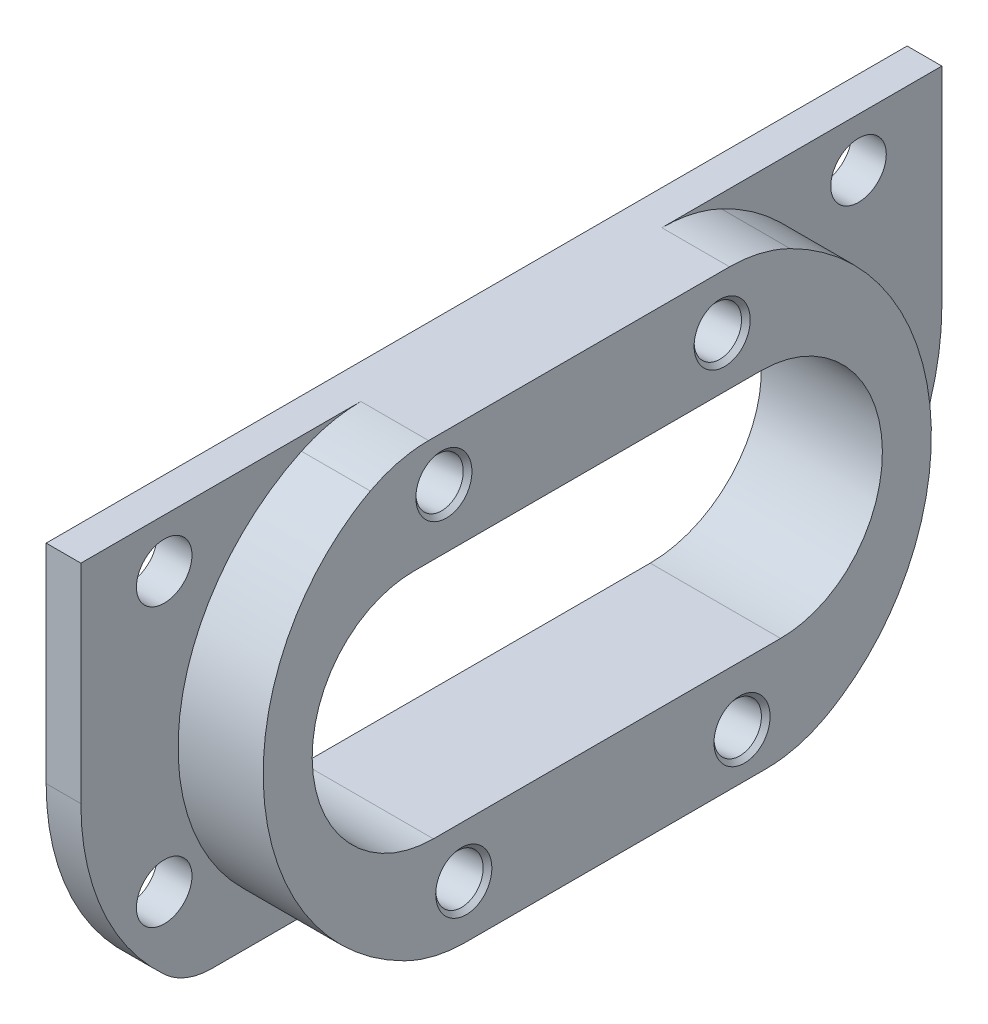
ISO-10303-21;
HEADER;
FILE_DESCRIPTION(('STEP AP214'),'2;1');
FILE_NAME('part.step','',(''),(''),'','','');
FILE_SCHEMA(('AUTOMOTIVE_DESIGN { 1 0 10303 214 1 1 1 1 }'));
ENDSEC;
DATA;
#1=APPLICATION_CONTEXT('core data for automotive mechanical design processes');
#2=APPLICATION_PROTOCOL_DEFINITION('international standard','automotive_design',2000,#1);
#3=PRODUCT_CONTEXT('',#1,'mechanical');
#4=PRODUCT('Part','Part','',(#3));
#5=PRODUCT_RELATED_PRODUCT_CATEGORY('part','',(#4));
#6=PRODUCT_DEFINITION_FORMATION('','',#4);
#7=PRODUCT_DEFINITION_CONTEXT('part definition',#1,'design');
#8=PRODUCT_DEFINITION('design','',#6,#7);
#9=PRODUCT_DEFINITION_SHAPE('','',#8);
#10=(LENGTH_UNIT() NAMED_UNIT(*) SI_UNIT(.MILLI.,.METRE.));
#11=(NAMED_UNIT(*) PLANE_ANGLE_UNIT() SI_UNIT($,.RADIAN.));
#12=(NAMED_UNIT(*) SI_UNIT($,.STERADIAN.) SOLID_ANGLE_UNIT());
#13=UNCERTAINTY_MEASURE_WITH_UNIT(LENGTH_MEASURE(1.E-05),#10,'distance_accuracy_value','');
#14=(GEOMETRIC_REPRESENTATION_CONTEXT(3) GLOBAL_UNCERTAINTY_ASSIGNED_CONTEXT((#13)) GLOBAL_UNIT_ASSIGNED_CONTEXT((#10,
#11,#12)) REPRESENTATION_CONTEXT('',''));
#15=CARTESIAN_POINT('',(0.,0.,0.));
#16=DIRECTION('',(0.,0.,1.));
#17=DIRECTION('',(1.,0.,0.));
#18=AXIS2_PLACEMENT_3D('',#15,#16,#17);
#19=CARTESIAN_POINT('',(20.,0.,-25.));
#20=DIRECTION('',(-1.,0.,0.));
#21=DIRECTION('',(0.,0.,1.));
#22=AXIS2_PLACEMENT_3D('',#19,#20,#21);
#23=CYLINDRICAL_SURFACE('',#22,37.);
#24=CARTESIAN_POINT('',(5.,0.,-25.));
#25=DIRECTION('',(1.,0.,0.));
#26=DIRECTION('',(0.,0.,-1.));
#27=AXIS2_PLACEMENT_3D('',#24,#25,#26);
#28=CIRCLE('',#27,37.);
#29=CARTESIAN_POINT('',(5.,-27.4074074074074,-49.8562672017419));
#30=VERTEX_POINT('',#29);
#31=CARTESIAN_POINT('',(5.,0.,-62.));
#32=VERTEX_POINT('',#31);
#33=EDGE_CURVE('E304',#30,#32,#28,.T.);
#34=ORIENTED_EDGE('',*,*,#33,.F.);
#35=DIRECTION('',(-1.,0.,0.));
#36=VECTOR('',#35,1.);
#37=CARTESIAN_POINT('',(20.,-27.4074074074074,-49.8562672017419));
#38=LINE('',#37,#36);
#39=CARTESIAN_POINT('',(0.,-27.4074074074074,-49.8562672017419));
#40=VERTEX_POINT('',#39);
#41=EDGE_CURVE('E353',#30,#40,#38,.T.);
#42=ORIENTED_EDGE('',*,*,#41,.T.);
#43=CARTESIAN_POINT('',(0.,0.,-25.));
#44=DIRECTION('',(1.,0.,0.));
#45=DIRECTION('',(0.,0.,-1.));
#46=AXIS2_PLACEMENT_3D('',#43,#44,#45);
#47=CIRCLE('',#46,37.);
#48=CARTESIAN_POINT('',(0.,0.,-62.));
#49=VERTEX_POINT('',#48);
#50=EDGE_CURVE('E350',#40,#49,#47,.T.);
#51=ORIENTED_EDGE('',*,*,#50,.T.);
#52=DIRECTION('',(-1.,0.,0.));
#53=VECTOR('',#52,1.);
#54=CARTESIAN_POINT('',(20.,0.,-62.));
#55=LINE('',#54,#53);
#56=EDGE_CURVE('E48',#32,#49,#55,.T.);
#57=ORIENTED_EDGE('',*,*,#56,.F.);
#58=EDGE_LOOP('',(#34,#42,#51,#57));
#59=FACE_BOUND('',#58,.T.);
#60=ADVANCED_FACE('F41',(#59),#23,.T.);
#61=CARTESIAN_POINT('',(20.,0.,-62.));
#62=DIRECTION('',(0.,0.,1.));
#63=DIRECTION('',(0.,-1.,0.));
#64=AXIS2_PLACEMENT_3D('',#61,#62,#63);
#65=PLANE('',#64);
#66=DIRECTION('',(0.,1.,0.));
#67=VECTOR('',#66,1.);
#68=CARTESIAN_POINT('',(5.,0.,-62.));
#69=LINE('',#68,#67);
#70=CARTESIAN_POINT('',(5.,30.,-62.));
#71=VERTEX_POINT('',#70);
#72=EDGE_CURVE('E307',#32,#71,#69,.T.);
#73=ORIENTED_EDGE('',*,*,#72,.F.);
#74=ORIENTED_EDGE('',*,*,#56,.T.);
#75=DIRECTION('',(0.,1.,0.));
#76=VECTOR('',#75,1.);
#77=CARTESIAN_POINT('',(0.,0.,-62.));
#78=LINE('',#77,#76);
#79=CARTESIAN_POINT('',(0.,30.,-62.));
#80=VERTEX_POINT('',#79);
#81=EDGE_CURVE('E357',#49,#80,#78,.T.);
#82=ORIENTED_EDGE('',*,*,#81,.T.);
#83=DIRECTION('',(-1.,0.,0.));
#84=VECTOR('',#83,1.);
#85=CARTESIAN_POINT('',(20.,30.,-62.));
#86=LINE('',#85,#84);
#87=EDGE_CURVE('E388',#71,#80,#86,.T.);
#88=ORIENTED_EDGE('',*,*,#87,.F.);
#89=EDGE_LOOP('',(#73,#74,#82,#88));
#90=FACE_BOUND('',#89,.T.);
#91=ADVANCED_FACE('F472',(#90),#65,.F.);
#92=CARTESIAN_POINT('',(20.,30.,62.));
#93=DIRECTION('',(0.,0.,-1.));
#94=DIRECTION('',(0.,1.,0.));
#95=AXIS2_PLACEMENT_3D('',#92,#93,#94);
#96=PLANE('',#95);
#97=DIRECTION('',(0.,-1.,0.));
#98=VECTOR('',#97,1.);
#99=CARTESIAN_POINT('',(5.,30.,62.));
#100=LINE('',#99,#98);
#101=CARTESIAN_POINT('',(5.,30.,62.));
#102=VERTEX_POINT('',#101);
#103=CARTESIAN_POINT('',(5.,0.,62.));
#104=VERTEX_POINT('',#103);
#105=EDGE_CURVE('E316',#102,#104,#100,.T.);
#106=ORIENTED_EDGE('',*,*,#105,.F.);
#107=DIRECTION('',(-1.,0.,0.));
#108=VECTOR('',#107,1.);
#109=CARTESIAN_POINT('',(20.,30.,62.));
#110=LINE('',#109,#108);
#111=CARTESIAN_POINT('',(0.,30.,62.));
#112=VERTEX_POINT('',#111);
#113=EDGE_CURVE('E386',#102,#112,#110,.T.);
#114=ORIENTED_EDGE('',*,*,#113,.T.);
#115=DIRECTION('',(0.,-1.,0.));
#116=VECTOR('',#115,1.);
#117=CARTESIAN_POINT('',(0.,30.,62.));
#118=LINE('',#117,#116);
#119=CARTESIAN_POINT('',(0.,0.,62.));
#120=VERTEX_POINT('',#119);
#121=EDGE_CURVE('E363',#112,#120,#118,.T.);
#122=ORIENTED_EDGE('',*,*,#121,.T.);
#123=DIRECTION('',(-1.,0.,0.));
#124=VECTOR('',#123,1.);
#125=CARTESIAN_POINT('',(20.,0.,62.));
#126=LINE('',#125,#124);
#127=EDGE_CURVE('E384',#104,#120,#126,.T.);
#128=ORIENTED_EDGE('',*,*,#127,.F.);
#129=EDGE_LOOP('',(#106,#114,#122,#128));
#130=FACE_BOUND('',#129,.T.);
#131=ADVANCED_FACE('F413',(#130),#96,.F.);
#132=CARTESIAN_POINT('',(20.,0.,25.));
#133=DIRECTION('',(-1.,0.,0.));
#134=DIRECTION('',(0.,0.,1.));
#135=AXIS2_PLACEMENT_3D('',#132,#133,#134);
#136=CYLINDRICAL_SURFACE('',#135,37.);
#137=CARTESIAN_POINT('',(5.,0.,25.));
#138=DIRECTION('',(1.,0.,0.));
#139=DIRECTION('',(0.,0.,-1.));
#140=AXIS2_PLACEMENT_3D('',#137,#138,#139);
#141=CIRCLE('',#140,37.);
#142=CARTESIAN_POINT('',(5.,-27.4074074074074,49.8562672017419));
#143=VERTEX_POINT('',#142);
#144=EDGE_CURVE('E314',#104,#143,#141,.T.);
#145=ORIENTED_EDGE('',*,*,#144,.F.);
#146=ORIENTED_EDGE('',*,*,#127,.T.);
#147=CARTESIAN_POINT('',(0.,0.,25.));
#148=DIRECTION('',(1.,0.,0.));
#149=DIRECTION('',(0.,0.,-1.));
#150=AXIS2_PLACEMENT_3D('',#147,#148,#149);
#151=CIRCLE('',#150,37.);
#152=CARTESIAN_POINT('',(0.,-27.4074074074074,49.8562672017419));
#153=VERTEX_POINT('',#152);
#154=EDGE_CURVE('E366',#120,#153,#151,.T.);
#155=ORIENTED_EDGE('',*,*,#154,.T.);
#156=DIRECTION('',(-1.,0.,0.));
#157=VECTOR('',#156,1.);
#158=CARTESIAN_POINT('',(20.,-27.4074074074074,49.8562672017419));
#159=LINE('',#158,#157);
#160=EDGE_CURVE('E382',#143,#153,#159,.T.);
#161=ORIENTED_EDGE('',*,*,#160,.F.);
#162=EDGE_LOOP('',(#145,#146,#155,#161));
#163=FACE_BOUND('',#162,.T.);
#164=ADVANCED_FACE('F429',(#163),#136,.T.);
#165=CARTESIAN_POINT('',(20.,-20.,43.138357147217));
#166=DIRECTION('',(-1.,0.,0.));
#167=DIRECTION('',(0.,0.,1.));
#168=AXIS2_PLACEMENT_3D('',#165,#166,#167);
#169=CYLINDRICAL_SURFACE('',#168,10.);
#170=CARTESIAN_POINT('',(5.,-20.,43.138357147217));
#171=DIRECTION('',(1.,0.,0.));
#172=DIRECTION('',(0.,0.,-1.));
#173=AXIS2_PLACEMENT_3D('',#170,#171,#172);
#174=CIRCLE('',#173,10.);
#175=CARTESIAN_POINT('',(5.,-30.,43.138357147217));
#176=VERTEX_POINT('',#175);
#177=EDGE_CURVE('E312',#143,#176,#174,.T.);
#178=ORIENTED_EDGE('',*,*,#177,.F.);
#179=ORIENTED_EDGE('',*,*,#160,.T.);
#180=CARTESIAN_POINT('',(0.,-20.,43.138357147217));
#181=DIRECTION('',(1.,0.,0.));
#182=DIRECTION('',(0.,0.,-1.));
#183=AXIS2_PLACEMENT_3D('',#180,#181,#182);
#184=CIRCLE('',#183,10.);
#185=CARTESIAN_POINT('',(0.,-30.,43.138357147217));
#186=VERTEX_POINT('',#185);
#187=EDGE_CURVE('E369',#153,#186,#184,.T.);
#188=ORIENTED_EDGE('',*,*,#187,.T.);
#189=DIRECTION('',(-1.,0.,0.));
#190=VECTOR('',#189,1.);
#191=CARTESIAN_POINT('',(20.,-30.,43.138357147217));
#192=LINE('',#191,#190);
#193=EDGE_CURVE('E380',#176,#186,#192,.T.);
#194=ORIENTED_EDGE('',*,*,#193,.F.);
#195=EDGE_LOOP('',(#178,#179,#188,#194));
#196=FACE_BOUND('',#195,.T.);
#197=ADVANCED_FACE('F434',(#196),#169,.T.);
#198=CARTESIAN_POINT('',(20.,-30.,43.138357147217));
#199=DIRECTION('',(0.,1.,0.));
#200=DIRECTION('',(0.,0.,1.));
#201=AXIS2_PLACEMENT_3D('',#198,#199,#200);
#202=PLANE('',#201);
#203=DIRECTION('',(1.,0.,0.));
#204=VECTOR('',#203,1.);
#205=CARTESIAN_POINT('',(5.,-30.,21.6717685614745));
#206=LINE('',#205,#204);
#207=CARTESIAN_POINT('',(5.,-30.,21.6717685614745));
#208=VERTEX_POINT('',#207);
#209=CARTESIAN_POINT('',(20.,-30.,21.6717685614745));
#210=VERTEX_POINT('',#209);
#211=EDGE_CURVE('E267',#208,#210,#206,.T.);
#212=ORIENTED_EDGE('',*,*,#211,.F.);
#213=DIRECTION('',(0.,0.,-1.));
#214=VECTOR('',#213,1.);
#215=CARTESIAN_POINT('',(5.,-30.,43.138357147217));
#216=LINE('',#215,#214);
#217=EDGE_CURVE('E305',#176,#208,#216,.T.);
#218=ORIENTED_EDGE('',*,*,#217,.F.);
#219=ORIENTED_EDGE('',*,*,#193,.T.);
#220=DIRECTION('',(0.,0.,-1.));
#221=VECTOR('',#220,1.);
#222=CARTESIAN_POINT('',(0.,-30.,43.138357147217));
#223=LINE('',#222,#221);
#224=CARTESIAN_POINT('',(0.,-30.,-43.1383571472171));
#225=VERTEX_POINT('',#224);
#226=EDGE_CURVE('E372',#186,#225,#223,.T.);
#227=ORIENTED_EDGE('',*,*,#226,.T.);
#228=DIRECTION('',(-1.,0.,0.));
#229=VECTOR('',#228,1.);
#230=CARTESIAN_POINT('',(20.,-30.,-43.1383571472171));
#231=LINE('',#230,#229);
#232=CARTESIAN_POINT('',(5.,-30.,-43.1383571472171));
#233=VERTEX_POINT('',#232);
#234=EDGE_CURVE('E378',#233,#225,#231,.T.);
#235=ORIENTED_EDGE('',*,*,#234,.F.);
#236=CARTESIAN_POINT('',(5.,-30.,-21.6717685614745));
#237=VERTEX_POINT('',#236);
#238=EDGE_CURVE('E302',#237,#233,#216,.T.);
#239=ORIENTED_EDGE('',*,*,#238,.F.);
#240=DIRECTION('',(1.,0.,0.));
#241=VECTOR('',#240,1.);
#242=CARTESIAN_POINT('',(5.,-30.,-21.6717685614745));
#243=LINE('',#242,#241);
#244=CARTESIAN_POINT('',(20.,-30.,-21.6717685614745));
#245=VERTEX_POINT('',#244);
#246=EDGE_CURVE('E287',#237,#245,#243,.T.);
#247=ORIENTED_EDGE('',*,*,#246,.T.);
#248=DIRECTION('',(0.,0.,-1.));
#249=VECTOR('',#248,1.);
#250=CARTESIAN_POINT('',(20.,-30.,43.138357147217));
#251=LINE('',#250,#249);
#252=EDGE_CURVE('E351',#210,#245,#251,.T.);
#253=ORIENTED_EDGE('',*,*,#252,.F.);
#254=EDGE_LOOP('',(#212,#218,#219,#227,#235,#239,#247,#253));
#255=FACE_BOUND('',#254,.T.);
#256=ADVANCED_FACE('F437',(#255),#202,.F.);
#257=CARTESIAN_POINT('',(20.,-20.,-43.1383571472171));
#258=DIRECTION('',(-1.,0.,0.));
#259=DIRECTION('',(0.,0.,1.));
#260=AXIS2_PLACEMENT_3D('',#257,#258,#259);
#261=CYLINDRICAL_SURFACE('',#260,9.99999999999999);
#262=CARTESIAN_POINT('',(5.,-20.,-43.1383571472171));
#263=DIRECTION('',(1.,0.,0.));
#264=DIRECTION('',(0.,0.,-1.));
#265=AXIS2_PLACEMENT_3D('',#262,#263,#264);
#266=CIRCLE('',#265,9.99999999999999);
#267=EDGE_CURVE('E300',#233,#30,#266,.T.);
#268=ORIENTED_EDGE('',*,*,#267,.F.);
#269=ORIENTED_EDGE('',*,*,#234,.T.);
#270=CARTESIAN_POINT('',(0.,-20.,-43.1383571472171));
#271=DIRECTION('',(1.,0.,0.));
#272=DIRECTION('',(0.,0.,-1.));
#273=AXIS2_PLACEMENT_3D('',#270,#271,#272);
#274=CIRCLE('',#273,9.99999999999999);
#275=EDGE_CURVE('E354',#225,#40,#274,.T.);
#276=ORIENTED_EDGE('',*,*,#275,.T.);
#277=ORIENTED_EDGE('',*,*,#41,.F.);
#278=EDGE_LOOP('',(#268,#269,#276,#277));
#279=FACE_BOUND('',#278,.T.);
#280=ADVANCED_FACE('F467',(#279),#261,.T.);
#281=CARTESIAN_POINT('',(20.,23.,50.));
#282=DIRECTION('',(-1.,0.,0.));
#283=DIRECTION('',(0.,0.,1.));
#284=AXIS2_PLACEMENT_3D('',#281,#282,#283);
#285=CYLINDRICAL_SURFACE('',#284,4.00000000000001);
#286=CARTESIAN_POINT('',(0.,23.,50.));
#287=DIRECTION('',(1.,0.,0.));
#288=DIRECTION('',(0.,0.,-1.));
#289=AXIS2_PLACEMENT_3D('',#286,#287,#288);
#290=CIRCLE('',#289,4.00000000000001);
#291=CARTESIAN_POINT('',(0.,23.,46.));
#292=VERTEX_POINT('',#291);
#293=EDGE_CURVE('E327',#292,#292,#290,.T.);
#294=ORIENTED_EDGE('',*,*,#293,.F.);
#295=EDGE_LOOP('',(#294));
#296=FACE_BOUND('',#295,.T.);
#297=CARTESIAN_POINT('',(5.,23.,50.));
#298=DIRECTION('',(1.,0.,0.));
#299=DIRECTION('',(0.,0.,-1.));
#300=AXIS2_PLACEMENT_3D('',#297,#298,#299);
#301=CIRCLE('',#300,4.00000000000001);
#302=CARTESIAN_POINT('',(5.,23.,46.));
#303=VERTEX_POINT('',#302);
#304=EDGE_CURVE('E297',#303,#303,#301,.T.);
#305=ORIENTED_EDGE('',*,*,#304,.T.);
#306=EDGE_LOOP('',(#305));
#307=FACE_BOUND('',#306,.T.);
#308=ADVANCED_FACE('F491',(#296,#307),#285,.F.);
#309=CARTESIAN_POINT('',(20.,23.,-50.));
#310=DIRECTION('',(-1.,0.,0.));
#311=DIRECTION('',(0.,0.,1.));
#312=AXIS2_PLACEMENT_3D('',#309,#310,#311);
#313=CYLINDRICAL_SURFACE('',#312,4.00000000000001);
#314=CARTESIAN_POINT('',(0.,23.,-50.));
#315=DIRECTION('',(1.,0.,0.));
#316=DIRECTION('',(0.,0.,-1.));
#317=AXIS2_PLACEMENT_3D('',#314,#315,#316);
#318=CIRCLE('',#317,4.00000000000001);
#319=CARTESIAN_POINT('',(0.,23.,-54.));
#320=VERTEX_POINT('',#319);
#321=EDGE_CURVE('E324',#320,#320,#318,.T.);
#322=ORIENTED_EDGE('',*,*,#321,.F.);
#323=EDGE_LOOP('',(#322));
#324=FACE_BOUND('',#323,.T.);
#325=CARTESIAN_POINT('',(5.,23.,-50.));
#326=DIRECTION('',(1.,0.,0.));
#327=DIRECTION('',(0.,0.,-1.));
#328=AXIS2_PLACEMENT_3D('',#325,#326,#327);
#329=CIRCLE('',#328,4.00000000000001);
#330=CARTESIAN_POINT('',(5.,23.,-54.));
#331=VERTEX_POINT('',#330);
#332=EDGE_CURVE('E294',#331,#331,#329,.T.);
#333=ORIENTED_EDGE('',*,*,#332,.T.);
#334=EDGE_LOOP('',(#333));
#335=FACE_BOUND('',#334,.T.);
#336=ADVANCED_FACE('F510',(#324,#335),#313,.F.);
#337=CARTESIAN_POINT('',(20.,-17.,-50.0000000000004));
#338=DIRECTION('',(-1.,0.,0.));
#339=DIRECTION('',(0.,0.,1.));
#340=AXIS2_PLACEMENT_3D('',#337,#338,#339);
#341=CYLINDRICAL_SURFACE('',#340,4.00000000000001);
#342=CARTESIAN_POINT('',(0.,-17.,-50.0000000000004));
#343=DIRECTION('',(1.,0.,0.));
#344=DIRECTION('',(0.,0.,-1.));
#345=AXIS2_PLACEMENT_3D('',#342,#343,#344);
#346=CIRCLE('',#345,4.00000000000001);
#347=CARTESIAN_POINT('',(0.,-17.,-54.0000000000004));
#348=VERTEX_POINT('',#347);
#349=EDGE_CURVE('E321',#348,#348,#346,.T.);
#350=ORIENTED_EDGE('',*,*,#349,.F.);
#351=EDGE_LOOP('',(#350));
#352=FACE_BOUND('',#351,.T.);
#353=CARTESIAN_POINT('',(5.,-17.,-50.0000000000004));
#354=DIRECTION('',(1.,0.,0.));
#355=DIRECTION('',(0.,0.,-1.));
#356=AXIS2_PLACEMENT_3D('',#353,#354,#355);
#357=CIRCLE('',#356,4.00000000000001);
#358=CARTESIAN_POINT('',(5.,-17.,-54.0000000000004));
#359=VERTEX_POINT('',#358);
#360=EDGE_CURVE('E291',#359,#359,#357,.T.);
#361=ORIENTED_EDGE('',*,*,#360,.T.);
#362=EDGE_LOOP('',(#361));
#363=FACE_BOUND('',#362,.T.);
#364=ADVANCED_FACE('F514',(#352,#363),#341,.F.);
#365=CARTESIAN_POINT('',(20.,-17.,49.9999999999996));
#366=DIRECTION('',(-1.,0.,0.));
#367=DIRECTION('',(0.,0.,1.));
#368=AXIS2_PLACEMENT_3D('',#365,#366,#367);
#369=CYLINDRICAL_SURFACE('',#368,4.00000000000001);
#370=CARTESIAN_POINT('',(0.,-17.,49.9999999999996));
#371=DIRECTION('',(1.,0.,0.));
#372=DIRECTION('',(0.,0.,-1.));
#373=AXIS2_PLACEMENT_3D('',#370,#371,#372);
#374=CIRCLE('',#373,4.00000000000001);
#375=CARTESIAN_POINT('',(0.,-17.,45.9999999999996));
#376=VERTEX_POINT('',#375);
#377=EDGE_CURVE('E318',#376,#376,#374,.T.);
#378=ORIENTED_EDGE('',*,*,#377,.F.);
#379=EDGE_LOOP('',(#378));
#380=FACE_BOUND('',#379,.T.);
#381=CARTESIAN_POINT('',(5.,-17.,49.9999999999996));
#382=DIRECTION('',(1.,0.,0.));
#383=DIRECTION('',(0.,0.,-1.));
#384=AXIS2_PLACEMENT_3D('',#381,#382,#383);
#385=CIRCLE('',#384,4.00000000000001);
#386=CARTESIAN_POINT('',(5.,-17.,45.9999999999996));
#387=VERTEX_POINT('',#386);
#388=EDGE_CURVE('E271',#387,#387,#385,.T.);
#389=ORIENTED_EDGE('',*,*,#388,.T.);
#390=EDGE_LOOP('',(#389));
#391=FACE_BOUND('',#390,.T.);
#392=ADVANCED_FACE('F393',(#380,#391),#369,.F.);
#393=CARTESIAN_POINT('',(0.,0.,-25.));
#394=DIRECTION('',(1.,0.,0.));
#395=DIRECTION('',(0.,0.,-1.));
#396=AXIS2_PLACEMENT_3D('',#393,#394,#395);
#397=PLANE('',#396);
#398=ORIENTED_EDGE('',*,*,#50,.F.);
#399=ORIENTED_EDGE('',*,*,#275,.F.);
#400=ORIENTED_EDGE('',*,*,#226,.F.);
#401=ORIENTED_EDGE('',*,*,#187,.F.);
#402=ORIENTED_EDGE('',*,*,#154,.F.);
#403=ORIENTED_EDGE('',*,*,#121,.F.);
#404=DIRECTION('',(0.,0.,1.));
#405=VECTOR('',#404,1.);
#406=CARTESIAN_POINT('',(0.,30.,62.));
#407=LINE('',#406,#405);
#408=EDGE_CURVE('E360',#80,#112,#407,.T.);
#409=ORIENTED_EDGE('',*,*,#408,.F.);
#410=ORIENTED_EDGE('',*,*,#81,.F.);
#411=EDGE_LOOP('',(#398,#399,#400,#401,#402,#403,#409,#410));
#412=FACE_BOUND('',#411,.T.);
#413=CARTESIAN_POINT('',(0.,0.,25.));
#414=DIRECTION('',(1.,0.,0.));
#415=DIRECTION('',(0.,0.,-1.));
#416=AXIS2_PLACEMENT_3D('',#413,#414,#415);
#417=CIRCLE('',#416,16.);
#418=CARTESIAN_POINT('',(0.,16.,25.));
#419=VERTEX_POINT('',#418);
#420=CARTESIAN_POINT('',(0.,-16.,25.));
#421=VERTEX_POINT('',#420);
#422=EDGE_CURVE('E330',#419,#421,#417,.T.);
#423=ORIENTED_EDGE('',*,*,#422,.T.);
#424=DIRECTION('',(0.,0.,-1.));
#425=VECTOR('',#424,1.);
#426=CARTESIAN_POINT('',(0.,-16.,25.));
#427=LINE('',#426,#425);
#428=CARTESIAN_POINT('',(0.,-16.,-25.));
#429=VERTEX_POINT('',#428);
#430=EDGE_CURVE('E333',#421,#429,#427,.T.);
#431=ORIENTED_EDGE('',*,*,#430,.T.);
#432=CARTESIAN_POINT('',(0.,0.,-25.));
#433=DIRECTION('',(1.,0.,0.));
#434=DIRECTION('',(0.,0.,-1.));
#435=AXIS2_PLACEMENT_3D('',#432,#433,#434);
#436=CIRCLE('',#435,16.);
#437=CARTESIAN_POINT('',(0.,16.,-25.));
#438=VERTEX_POINT('',#437);
#439=EDGE_CURVE('E336',#429,#438,#436,.T.);
#440=ORIENTED_EDGE('',*,*,#439,.T.);
#441=DIRECTION('',(0.,0.,1.));
#442=VECTOR('',#441,1.);
#443=CARTESIAN_POINT('',(0.,16.,-25.));
#444=LINE('',#443,#442);
#445=EDGE_CURVE('E339',#438,#419,#444,.T.);
#446=ORIENTED_EDGE('',*,*,#445,.T.);
#447=EDGE_LOOP('',(#423,#431,#440,#446));
#448=FACE_BOUND('',#447,.T.);
#449=ORIENTED_EDGE('',*,*,#293,.T.);
#450=EDGE_LOOP('',(#449));
#451=FACE_BOUND('',#450,.T.);
#452=ORIENTED_EDGE('',*,*,#321,.T.);
#453=EDGE_LOOP('',(#452));
#454=FACE_BOUND('',#453,.T.);
#455=ORIENTED_EDGE('',*,*,#349,.T.);
#456=EDGE_LOOP('',(#455));
#457=FACE_BOUND('',#456,.T.);
#458=ORIENTED_EDGE('',*,*,#377,.T.);
#459=EDGE_LOOP('',(#458));
#460=FACE_BOUND('',#459,.T.);
#461=ADVANCED_FACE('F423',(#412,#448,#451,#454,#457,#460),#397,.F.);
#462=CARTESIAN_POINT('',(20.,30.,62.));
#463=DIRECTION('',(0.,-1.,0.));
#464=DIRECTION('',(0.,0.,-1.));
#465=AXIS2_PLACEMENT_3D('',#462,#463,#464);
#466=PLANE('',#465);
#467=DIRECTION('',(1.,0.,0.));
#468=VECTOR('',#467,1.);
#469=CARTESIAN_POINT('',(5.,30.,21.6717685614745));
#470=LINE('',#469,#468);
#471=CARTESIAN_POINT('',(5.,30.,21.6717685614745));
#472=VERTEX_POINT('',#471);
#473=CARTESIAN_POINT('',(14.7506801884445,30.,21.6717685614745));
#474=VERTEX_POINT('',#473);
#475=EDGE_CURVE('E275',#472,#474,#470,.T.);
#476=ORIENTED_EDGE('',*,*,#475,.T.);
#477=DIRECTION('',(0.,0.,-1.));
#478=VECTOR('',#477,1.);
#479=CARTESIAN_POINT('',(14.7506801884445,30.,62.));
#480=LINE('',#479,#478);
#481=CARTESIAN_POINT('',(14.7506801884445,30.,-21.6717685614745));
#482=VERTEX_POINT('',#481);
#483=EDGE_CURVE('E231',#474,#482,#480,.T.);
#484=ORIENTED_EDGE('',*,*,#483,.T.);
#485=DIRECTION('',(1.,0.,0.));
#486=VECTOR('',#485,1.);
#487=CARTESIAN_POINT('',(5.,30.,-21.6717685614745));
#488=LINE('',#487,#486);
#489=CARTESIAN_POINT('',(5.,30.,-21.6717685614745));
#490=VERTEX_POINT('',#489);
#491=EDGE_CURVE('E278',#490,#482,#488,.T.);
#492=ORIENTED_EDGE('',*,*,#491,.F.);
#493=DIRECTION('',(0.,0.,1.));
#494=VECTOR('',#493,1.);
#495=CARTESIAN_POINT('',(5.,30.,62.));
#496=LINE('',#495,#494);
#497=EDGE_CURVE('E309',#71,#490,#496,.T.);
#498=ORIENTED_EDGE('',*,*,#497,.F.);
#499=ORIENTED_EDGE('',*,*,#87,.T.);
#500=ORIENTED_EDGE('',*,*,#408,.T.);
#501=ORIENTED_EDGE('',*,*,#113,.F.);
#502=EDGE_CURVE('E311',#472,#102,#496,.T.);
#503=ORIENTED_EDGE('',*,*,#502,.F.);
#504=EDGE_LOOP('',(#476,#484,#492,#498,#499,#500,#501,#503));
#505=FACE_BOUND('',#504,.T.);
#506=ADVANCED_FACE('F414',(#505),#466,.F.);
#507=CARTESIAN_POINT('',(20.,0.,25.));
#508=DIRECTION('',(-1.,0.,0.));
#509=DIRECTION('',(0.,0.,1.));
#510=AXIS2_PLACEMENT_3D('',#507,#508,#509);
#511=CYLINDRICAL_SURFACE('',#510,16.);
#512=CARTESIAN_POINT('',(17.3753400942223,0.,25.));
#513=DIRECTION('',(-0.996194698091746,-0.0871557427476583,0.));
#514=DIRECTION('',(-0.0871557427476583,0.996194698091746,0.));
#515=AXIS2_PLACEMENT_3D('',#512,#513,#514);
#516=ELLIPSE('',#515,16.0611174006936,16.);
#517=CARTESIAN_POINT('',(18.7751587106371,-16.,25.));
#518=VERTEX_POINT('',#517);
#519=CARTESIAN_POINT('',(15.9755214778075,16.,25.));
#520=VERTEX_POINT('',#519);
#521=EDGE_CURVE('E55',#518,#520,#516,.T.);
#522=ORIENTED_EDGE('',*,*,#521,.F.);
#523=DIRECTION('',(-1.,0.,0.));
#524=VECTOR('',#523,1.);
#525=CARTESIAN_POINT('',(20.,-16.,25.));
#526=LINE('',#525,#524);
#527=EDGE_CURVE('E348',#518,#421,#526,.T.);
#528=ORIENTED_EDGE('',*,*,#527,.T.);
#529=ORIENTED_EDGE('',*,*,#422,.F.);
#530=DIRECTION('',(-1.,0.,0.));
#531=VECTOR('',#530,1.);
#532=CARTESIAN_POINT('',(20.,16.,25.));
#533=LINE('',#532,#531);
#534=EDGE_CURVE('E342',#520,#419,#533,.T.);
#535=ORIENTED_EDGE('',*,*,#534,.F.);
#536=EDGE_LOOP('',(#522,#528,#529,#535));
#537=FACE_BOUND('',#536,.T.);
#538=ADVANCED_FACE('F481',(#537),#511,.F.);
#539=CARTESIAN_POINT('',(20.,-16.,25.));
#540=DIRECTION('',(0.,1.,0.));
#541=DIRECTION('',(0.,0.,1.));
#542=AXIS2_PLACEMENT_3D('',#539,#540,#541);
#543=PLANE('',#542);
#544=DIRECTION('',(0.,0.,1.));
#545=VECTOR('',#544,1.);
#546=CARTESIAN_POINT('',(18.7751587106371,-16.,25.));
#547=LINE('',#546,#545);
#548=CARTESIAN_POINT('',(18.7751587106371,-16.,-25.));
#549=VERTEX_POINT('',#548);
#550=EDGE_CURVE('E248',#549,#518,#547,.T.);
#551=ORIENTED_EDGE('',*,*,#550,.F.);
#552=DIRECTION('',(-1.,0.,0.));
#553=VECTOR('',#552,1.);
#554=CARTESIAN_POINT('',(20.,-16.,-25.));
#555=LINE('',#554,#553);
#556=EDGE_CURVE('E346',#549,#429,#555,.T.);
#557=ORIENTED_EDGE('',*,*,#556,.T.);
#558=ORIENTED_EDGE('',*,*,#430,.F.);
#559=ORIENTED_EDGE('',*,*,#527,.F.);
#560=EDGE_LOOP('',(#551,#557,#558,#559));
#561=FACE_BOUND('',#560,.T.);
#562=ADVANCED_FACE('F496',(#561),#543,.T.);
#563=CARTESIAN_POINT('',(20.,0.,-25.));
#564=DIRECTION('',(-1.,0.,0.));
#565=DIRECTION('',(0.,0.,1.));
#566=AXIS2_PLACEMENT_3D('',#563,#564,#565);
#567=CYLINDRICAL_SURFACE('',#566,16.);
#568=CARTESIAN_POINT('',(17.3753400942223,0.,-25.));
#569=DIRECTION('',(-0.996194698091746,-0.0871557427476583,0.));
#570=DIRECTION('',(-0.0871557427476583,0.996194698091746,0.));
#571=AXIS2_PLACEMENT_3D('',#568,#569,#570);
#572=ELLIPSE('',#571,16.0611174006936,16.);
#573=CARTESIAN_POINT('',(15.9755214778075,16.,-25.));
#574=VERTEX_POINT('',#573);
#575=EDGE_CURVE('E246',#574,#549,#572,.T.);
#576=ORIENTED_EDGE('',*,*,#575,.F.);
#577=DIRECTION('',(-1.,0.,0.));
#578=VECTOR('',#577,1.);
#579=CARTESIAN_POINT('',(20.,16.,-25.));
#580=LINE('',#579,#578);
#581=EDGE_CURVE('E344',#574,#438,#580,.T.);
#582=ORIENTED_EDGE('',*,*,#581,.T.);
#583=ORIENTED_EDGE('',*,*,#439,.F.);
#584=ORIENTED_EDGE('',*,*,#556,.F.);
#585=EDGE_LOOP('',(#576,#582,#583,#584));
#586=FACE_BOUND('',#585,.T.);
#587=ADVANCED_FACE('F500',(#586),#567,.F.);
#588=CARTESIAN_POINT('',(20.,16.,-25.));
#589=DIRECTION('',(0.,-1.,0.));
#590=DIRECTION('',(0.,0.,-1.));
#591=AXIS2_PLACEMENT_3D('',#588,#589,#590);
#592=PLANE('',#591);
#593=DIRECTION('',(0.,0.,-1.));
#594=VECTOR('',#593,1.);
#595=CARTESIAN_POINT('',(15.9755214778075,16.,-25.));
#596=LINE('',#595,#594);
#597=EDGE_CURVE('E244',#520,#574,#596,.T.);
#598=ORIENTED_EDGE('',*,*,#597,.F.);
#599=ORIENTED_EDGE('',*,*,#534,.T.);
#600=ORIENTED_EDGE('',*,*,#445,.F.);
#601=ORIENTED_EDGE('',*,*,#581,.F.);
#602=EDGE_LOOP('',(#598,#599,#600,#601));
#603=FACE_BOUND('',#602,.T.);
#604=ADVANCED_FACE('F399',(#603),#592,.T.);
#605=CARTESIAN_POINT('',(5.,0.,0.));
#606=DIRECTION('',(1.,0.,0.));
#607=DIRECTION('',(0.,0.,-1.));
#608=AXIS2_PLACEMENT_3D('',#605,#606,#607);
#609=PLANE('',#608);
#610=ORIENTED_EDGE('',*,*,#388,.F.);
#611=EDGE_LOOP('',(#610));
#612=FACE_BOUND('',#611,.T.);
#613=ORIENTED_EDGE('',*,*,#304,.F.);
#614=EDGE_LOOP('',(#613));
#615=FACE_BOUND('',#614,.T.);
#616=ORIENTED_EDGE('',*,*,#502,.T.);
#617=ORIENTED_EDGE('',*,*,#105,.T.);
#618=ORIENTED_EDGE('',*,*,#144,.T.);
#619=ORIENTED_EDGE('',*,*,#177,.T.);
#620=ORIENTED_EDGE('',*,*,#217,.T.);
#621=CARTESIAN_POINT('',(5.,-10.,21.6717685614745));
#622=DIRECTION('',(1.,0.,0.));
#623=DIRECTION('',(0.,0.,-1.));
#624=AXIS2_PLACEMENT_3D('',#621,#622,#623);
#625=CIRCLE('',#624,20.);
#626=CARTESIAN_POINT('',(5.,-28.0746561886051,30.2337078081475));
#627=VERTEX_POINT('',#626);
#628=EDGE_CURVE('E63',#627,#208,#625,.T.);
#629=ORIENTED_EDGE('',*,*,#628,.F.);
#630=CARTESIAN_POINT('',(5.,0.,16.9347826086956));
#631=DIRECTION('',(1.,0.,0.));
#632=DIRECTION('',(0.,0.,1.));
#633=AXIS2_PLACEMENT_3D('',#630,#631,#632);
#634=CIRCLE('',#633,31.0652173913043);
#635=CARTESIAN_POINT('',(5.,28.0746561886051,30.2337078081475));
#636=VERTEX_POINT('',#635);
#637=EDGE_CURVE('E264',#636,#627,#634,.T.);
#638=ORIENTED_EDGE('',*,*,#637,.F.);
#639=CARTESIAN_POINT('',(5.,9.99999999999999,21.6717685614745));
#640=DIRECTION('',(1.,0.,0.));
#641=DIRECTION('',(0.,0.,-1.));
#642=AXIS2_PLACEMENT_3D('',#639,#640,#641);
#643=CIRCLE('',#642,20.);
#644=EDGE_CURVE('E261',#472,#636,#643,.T.);
#645=ORIENTED_EDGE('',*,*,#644,.F.);
#646=EDGE_LOOP('',(#616,#617,#618,#619,#620,#629,#638,#645));
#647=FACE_BOUND('',#646,.T.);
#648=ADVANCED_FACE('F395',(#612,#615,#647),#609,.T.);
#649=CARTESIAN_POINT('',(5.,-10.,21.6717685614745));
#650=DIRECTION('',(1.,0.,0.));
#651=DIRECTION('',(0.,0.,-1.));
#652=AXIS2_PLACEMENT_3D('',#649,#650,#651);
#653=CYLINDRICAL_SURFACE('',#652,20.);
#654=CARTESIAN_POINT('',(18.2502267294815,-10.,21.6717685614745));
#655=DIRECTION('',(-0.996194698091746,-0.0871557427476583,0.));
#656=DIRECTION('',(0.0871557427476583,-0.996194698091746,0.));
#657=AXIS2_PLACEMENT_3D('',#654,#655,#656);
#658=ELLIPSE('',#657,20.0763967508669,20.);
#659=CARTESIAN_POINT('',(19.8315542431132,-28.0746561886051,30.2337078081475));
#660=VERTEX_POINT('',#659);
#661=EDGE_CURVE('E242',#660,#210,#658,.F.);
#662=ORIENTED_EDGE('',*,*,#661,.F.);
#663=DIRECTION('',(1.,0.,0.));
#664=VECTOR('',#663,1.);
#665=CARTESIAN_POINT('',(5.,-28.0746561886051,30.2337078081475));
#666=LINE('',#665,#664);
#667=EDGE_CURVE('E268',#627,#660,#666,.T.);
#668=ORIENTED_EDGE('',*,*,#667,.F.);
#669=ORIENTED_EDGE('',*,*,#628,.T.);
#670=ORIENTED_EDGE('',*,*,#211,.T.);
#671=EDGE_LOOP('',(#662,#668,#669,#670));
#672=FACE_BOUND('',#671,.T.);
#673=ADVANCED_FACE('F398',(#672),#653,.T.);
#674=CARTESIAN_POINT('',(5.,9.99999999999999,21.6717685614745));
#675=DIRECTION('',(1.,0.,0.));
#676=DIRECTION('',(0.,0.,-1.));
#677=AXIS2_PLACEMENT_3D('',#674,#675,#676);
#678=CYLINDRICAL_SURFACE('',#677,20.);
#679=CARTESIAN_POINT('',(16.500453458963,9.99999999999999,21.6717685614745));
#680=DIRECTION('',(-0.996194698091746,-0.0871557427476583,0.));
#681=DIRECTION('',(0.0871557427476583,-0.996194698091746,0.));
#682=AXIS2_PLACEMENT_3D('',#679,#680,#681);
#683=ELLIPSE('',#682,20.0763967508669,20.);
#684=CARTESIAN_POINT('',(14.9191259453314,28.0746561886051,30.2337078081475));
#685=VERTEX_POINT('',#684);
#686=EDGE_CURVE('E240',#474,#685,#683,.F.);
#687=ORIENTED_EDGE('',*,*,#686,.F.);
#688=ORIENTED_EDGE('',*,*,#475,.F.);
#689=ORIENTED_EDGE('',*,*,#644,.T.);
#690=DIRECTION('',(1.,0.,0.));
#691=VECTOR('',#690,1.);
#692=CARTESIAN_POINT('',(5.,28.0746561886051,30.2337078081475));
#693=LINE('',#692,#691);
#694=EDGE_CURVE('E272',#636,#685,#693,.T.);
#695=ORIENTED_EDGE('',*,*,#694,.T.);
#696=EDGE_LOOP('',(#687,#688,#689,#695));
#697=FACE_BOUND('',#696,.T.);
#698=ADVANCED_FACE('F446',(#697),#678,.T.);
#699=CARTESIAN_POINT('',(5.,0.,16.9347826086956));
#700=DIRECTION('',(1.,0.,0.));
#701=DIRECTION('',(0.,0.,-1.));
#702=AXIS2_PLACEMENT_3D('',#699,#700,#701);
#703=CYLINDRICAL_SURFACE('',#702,31.0652173913043);
#704=CARTESIAN_POINT('',(17.3753400942223,0.,16.9347826086956));
#705=DIRECTION('',(-0.996194698091746,-0.0871557427476583,0.));
#706=DIRECTION('',(0.0871557427476583,-0.996194698091746,0.));
#707=AXIS2_PLACEMENT_3D('',#704,#705,#706);
#708=ELLIPSE('',#707,31.1838814749879,31.0652173913043);
#709=EDGE_CURVE('E238',#685,#660,#708,.F.);
#710=ORIENTED_EDGE('',*,*,#709,.F.);
#711=ORIENTED_EDGE('',*,*,#694,.F.);
#712=ORIENTED_EDGE('',*,*,#637,.T.);
#713=ORIENTED_EDGE('',*,*,#667,.T.);
#714=EDGE_LOOP('',(#710,#711,#712,#713));
#715=FACE_BOUND('',#714,.T.);
#716=ADVANCED_FACE('F443',(#715),#703,.T.);
#717=ORIENTED_EDGE('',*,*,#360,.F.);
#718=EDGE_LOOP('',(#717));
#719=FACE_BOUND('',#718,.T.);
#720=ORIENTED_EDGE('',*,*,#332,.F.);
#721=EDGE_LOOP('',(#720));
#722=FACE_BOUND('',#721,.T.);
#723=ORIENTED_EDGE('',*,*,#497,.T.);
#724=CARTESIAN_POINT('',(5.,10.,-21.6717685614745));
#725=DIRECTION('',(1.,0.,0.));
#726=DIRECTION('',(0.,0.,-1.));
#727=AXIS2_PLACEMENT_3D('',#724,#725,#726);
#728=CIRCLE('',#727,20.);
#729=CARTESIAN_POINT('',(5.,28.0746561886051,-30.2337078081475));
#730=VERTEX_POINT('',#729);
#731=EDGE_CURVE('E258',#730,#490,#728,.T.);
#732=ORIENTED_EDGE('',*,*,#731,.F.);
#733=CARTESIAN_POINT('',(5.,0.,-16.9347826086956));
#734=DIRECTION('',(1.,0.,0.));
#735=DIRECTION('',(0.,0.,-1.));
#736=AXIS2_PLACEMENT_3D('',#733,#734,#735);
#737=CIRCLE('',#736,31.0652173913044);
#738=CARTESIAN_POINT('',(5.,-28.0746561886051,-30.2337078081476));
#739=VERTEX_POINT('',#738);
#740=EDGE_CURVE('E255',#739,#730,#737,.T.);
#741=ORIENTED_EDGE('',*,*,#740,.F.);
#742=CARTESIAN_POINT('',(5.,-9.99999999999999,-21.6717685614745));
#743=DIRECTION('',(1.,0.,0.));
#744=DIRECTION('',(0.,0.,-1.));
#745=AXIS2_PLACEMENT_3D('',#742,#743,#744);
#746=CIRCLE('',#745,20.);
#747=EDGE_CURVE('E252',#237,#739,#746,.T.);
#748=ORIENTED_EDGE('',*,*,#747,.F.);
#749=ORIENTED_EDGE('',*,*,#238,.T.);
#750=ORIENTED_EDGE('',*,*,#267,.T.);
#751=ORIENTED_EDGE('',*,*,#33,.T.);
#752=ORIENTED_EDGE('',*,*,#72,.T.);
#753=EDGE_LOOP('',(#723,#732,#741,#748,#749,#750,#751,#752));
#754=FACE_BOUND('',#753,.T.);
#755=ADVANCED_FACE('F401',(#719,#722,#754),#609,.T.);
#756=CARTESIAN_POINT('',(5.,10.,-21.6717685614745));
#757=DIRECTION('',(1.,0.,0.));
#758=DIRECTION('',(0.,0.,-1.));
#759=AXIS2_PLACEMENT_3D('',#756,#757,#758);
#760=CYLINDRICAL_SURFACE('',#759,20.);
#761=CARTESIAN_POINT('',(16.500453458963,10.,-21.6717685614745));
#762=DIRECTION('',(-0.996194698091746,-0.0871557427476583,0.));
#763=DIRECTION('',(0.0871557427476583,-0.996194698091746,0.));
#764=AXIS2_PLACEMENT_3D('',#761,#762,#763);
#765=ELLIPSE('',#764,20.0763967508669,20.);
#766=CARTESIAN_POINT('',(14.9191259453314,28.0746561886051,-30.2337078081475));
#767=VERTEX_POINT('',#766);
#768=EDGE_CURVE('E236',#767,#482,#765,.F.);
#769=ORIENTED_EDGE('',*,*,#768,.F.);
#770=DIRECTION('',(1.,0.,0.));
#771=VECTOR('',#770,1.);
#772=CARTESIAN_POINT('',(5.,28.0746561886051,-30.2337078081475));
#773=LINE('',#772,#771);
#774=EDGE_CURVE('E281',#730,#767,#773,.T.);
#775=ORIENTED_EDGE('',*,*,#774,.F.);
#776=ORIENTED_EDGE('',*,*,#731,.T.);
#777=ORIENTED_EDGE('',*,*,#491,.T.);
#778=EDGE_LOOP('',(#769,#775,#776,#777));
#779=FACE_BOUND('',#778,.T.);
#780=ADVANCED_FACE('F451',(#779),#760,.T.);
#781=CARTESIAN_POINT('',(5.,0.,-16.9347826086956));
#782=DIRECTION('',(1.,0.,0.));
#783=DIRECTION('',(0.,0.,-1.));
#784=AXIS2_PLACEMENT_3D('',#781,#782,#783);
#785=CYLINDRICAL_SURFACE('',#784,31.0652173913044);
#786=CARTESIAN_POINT('',(17.3753400942223,0.,-16.9347826086956));
#787=DIRECTION('',(-0.996194698091746,-0.0871557427476583,0.));
#788=DIRECTION('',(0.0871557427476583,-0.996194698091746,0.));
#789=AXIS2_PLACEMENT_3D('',#786,#787,#788);
#790=ELLIPSE('',#789,31.1838814749879,31.0652173913044);
#791=CARTESIAN_POINT('',(19.8315542431132,-28.0746561886051,-30.2337078081476));
#792=VERTEX_POINT('',#791);
#793=EDGE_CURVE('E234',#792,#767,#790,.F.);
#794=ORIENTED_EDGE('',*,*,#793,.F.);
#795=DIRECTION('',(1.,0.,0.));
#796=VECTOR('',#795,1.);
#797=CARTESIAN_POINT('',(5.,-28.0746561886051,-30.2337078081476));
#798=LINE('',#797,#796);
#799=EDGE_CURVE('E284',#739,#792,#798,.T.);
#800=ORIENTED_EDGE('',*,*,#799,.F.);
#801=ORIENTED_EDGE('',*,*,#740,.T.);
#802=ORIENTED_EDGE('',*,*,#774,.T.);
#803=EDGE_LOOP('',(#794,#800,#801,#802));
#804=FACE_BOUND('',#803,.T.);
#805=ADVANCED_FACE('F457',(#804),#785,.T.);
#806=CARTESIAN_POINT('',(5.,-9.99999999999999,-21.6717685614745));
#807=DIRECTION('',(1.,0.,0.));
#808=DIRECTION('',(0.,0.,-1.));
#809=AXIS2_PLACEMENT_3D('',#806,#807,#808);
#810=CYLINDRICAL_SURFACE('',#809,20.);
#811=CARTESIAN_POINT('',(18.2502267294815,-9.99999999999999,-21.6717685614745));
#812=DIRECTION('',(-0.996194698091746,-0.0871557427476583,0.));
#813=DIRECTION('',(0.0871557427476583,-0.996194698091746,0.));
#814=AXIS2_PLACEMENT_3D('',#811,#812,#813);
#815=ELLIPSE('',#814,20.0763967508669,20.);
#816=EDGE_CURVE('E12',#245,#792,#815,.F.);
#817=ORIENTED_EDGE('',*,*,#816,.F.);
#818=ORIENTED_EDGE('',*,*,#246,.F.);
#819=ORIENTED_EDGE('',*,*,#747,.T.);
#820=ORIENTED_EDGE('',*,*,#799,.T.);
#821=EDGE_LOOP('',(#817,#818,#819,#820));
#822=FACE_BOUND('',#821,.T.);
#823=ADVANCED_FACE('F460',(#822),#810,.T.);
#824=CARTESIAN_POINT('',(20.,-30.,62.));
#825=DIRECTION('',(-0.996194698091746,-0.0871557427476583,0.));
#826=DIRECTION('',(0.0871557427476583,-0.996194698091746,0.));
#827=AXIS2_PLACEMENT_3D('',#824,#825,#826);
#828=PLANE('',#827);
#829=CARTESIAN_POINT('',(15.2808329769219,23.9403258992491,20.));
#830=DIRECTION('',(0.996194698091746,0.0871557427476583,0.));
#831=DIRECTION('',(-0.0871557427476583,0.996194698091746,0.));
#832=AXIS2_PLACEMENT_3D('',#829,#830,#831);
#833=CIRCLE('',#832,4.025);
#834=CARTESIAN_POINT('',(14.9300311123626,27.9500095590684,20.));
#835=VERTEX_POINT('',#834);
#836=EDGE_CURVE('E204',#835,#835,#833,.T.);
#837=ORIENTED_EDGE('',*,*,#836,.F.);
#838=EDGE_LOOP('',(#837));
#839=FACE_BOUND('',#838,.T.);
#840=CARTESIAN_POINT('',(15.3720918318274,22.8972324145887,-19.9862929990223));
#841=DIRECTION('',(0.996194698091746,0.0871557427476583,0.));
#842=DIRECTION('',(-0.0871557427476583,0.996194698091746,0.));
#843=AXIS2_PLACEMENT_3D('',#840,#841,#842);
#844=CIRCLE('',#843,4.025);
#845=CARTESIAN_POINT('',(15.0212899672681,26.906916074408,-19.9862929990223));
#846=VERTEX_POINT('',#845);
#847=EDGE_CURVE('E197',#846,#846,#844,.T.);
#848=ORIENTED_EDGE('',*,*,#847,.F.);
#849=EDGE_LOOP('',(#848));
#850=FACE_BOUND('',#849,.T.);
#851=CARTESIAN_POINT('',(19.3757491795369,-22.8647804720646,21.2303165704696));
#852=DIRECTION('',(0.996194698091746,0.0871557427476583,0.));
#853=DIRECTION('',(-0.0871557427476583,0.996194698091746,0.));
#854=AXIS2_PLACEMENT_3D('',#851,#852,#853);
#855=CIRCLE('',#854,4.025);
#856=CARTESIAN_POINT('',(19.0249473149775,-18.8550968122453,21.2303165704696));
#857=VERTEX_POINT('',#856);
#858=EDGE_CURVE('E213',#857,#857,#855,.T.);
#859=ORIENTED_EDGE('',*,*,#858,.F.);
#860=EDGE_LOOP('',(#859));
#861=FACE_BOUND('',#860,.T.);
#862=CARTESIAN_POINT('',(19.4670080344424,-23.907873956725,-18.7559764285528));
#863=DIRECTION('',(0.996194698091746,0.0871557427476583,0.));
#864=DIRECTION('',(-0.0871557427476583,0.996194698091746,0.));
#865=AXIS2_PLACEMENT_3D('',#862,#863,#864);
#866=CIRCLE('',#865,4.025);
#867=CARTESIAN_POINT('',(19.1162061698831,-19.8981902969057,-18.7559764285528));
#868=VERTEX_POINT('',#867);
#869=EDGE_CURVE('E222',#868,#868,#866,.T.);
#870=ORIENTED_EDGE('',*,*,#869,.F.);
#871=EDGE_LOOP('',(#870));
#872=FACE_BOUND('',#871,.T.);
#873=ORIENTED_EDGE('',*,*,#521,.T.);
#874=ORIENTED_EDGE('',*,*,#597,.T.);
#875=ORIENTED_EDGE('',*,*,#575,.T.);
#876=ORIENTED_EDGE('',*,*,#550,.T.);
#877=EDGE_LOOP('',(#873,#874,#875,#876));
#878=FACE_BOUND('',#877,.T.);
#879=ORIENTED_EDGE('',*,*,#661,.T.);
#880=ORIENTED_EDGE('',*,*,#252,.T.);
#881=ORIENTED_EDGE('',*,*,#816,.T.);
#882=ORIENTED_EDGE('',*,*,#793,.T.);
#883=ORIENTED_EDGE('',*,*,#768,.T.);
#884=ORIENTED_EDGE('',*,*,#483,.F.);
#885=ORIENTED_EDGE('',*,*,#686,.T.);
#886=ORIENTED_EDGE('',*,*,#709,.T.);
#887=EDGE_LOOP('',(#879,#880,#881,#882,#883,#884,#885,#886));
#888=FACE_BOUND('',#887,.T.);
#889=ADVANCED_FACE('F526',(#839,#850,#861,#872,#878,#888),#828,.F.);
#890=CARTESIAN_POINT('',(6.55923971715531,-25.0371573559067,-18.7559764285528));
#891=DIRECTION('',(0.996194698091746,0.0871557427476583,0.));
#892=DIRECTION('',(-0.0871557427476583,0.996194698091746,0.));
#893=AXIS2_PLACEMENT_3D('',#890,#891,#892);
#894=CONICAL_SURFACE('',#893,3.4,1.02974425867665);
#895=CARTESIAN_POINT('',(4.52408756306621,-25.2152100979399,-18.7559764285528));
#896=VERTEX_POINT('',#895);
#897=VERTEX_LOOP('',#896);
#898=FACE_BOUND('',#897,.T.);
#899=CARTESIAN_POINT('',(6.55923971715531,-25.0371573559067,-18.7559764285528));
#900=DIRECTION('',(0.996194698091746,0.0871557427476583,0.));
#901=DIRECTION('',(-0.0871557427476583,0.996194698091746,0.));
#902=AXIS2_PLACEMENT_3D('',#899,#900,#901);
#903=CIRCLE('',#902,3.4);
#904=CARTESIAN_POINT('',(6.26291019181327,-21.6500953823948,-18.7559764285528));
#905=VERTEX_POINT('',#904);
#906=EDGE_CURVE('E228',#905,#905,#903,.T.);
#907=ORIENTED_EDGE('',*,*,#906,.T.);
#908=EDGE_LOOP('',(#907));
#909=FACE_BOUND('',#908,.T.);
#910=ADVANCED_FACE('F537',(#898,#909),#894,.F.);
#911=CARTESIAN_POINT('',(19.4670080344424,-23.907873956725,-18.7559764285528));
#912=DIRECTION('',(0.996194698091746,0.0871557427476583,0.));
#913=DIRECTION('',(-0.0871557427476583,0.996194698091746,0.));
#914=AXIS2_PLACEMENT_3D('',#911,#912,#913);
#915=CYLINDRICAL_SURFACE('',#914,3.4);
#916=ORIENTED_EDGE('',*,*,#906,.F.);
#917=EDGE_LOOP('',(#916));
#918=FACE_BOUND('',#917,.T.);
#919=CARTESIAN_POINT('',(18.8443863481351,-23.9623462959423,-18.7559764285528));
#920=DIRECTION('',(0.996194698091746,0.0871557427476583,0.));
#921=DIRECTION('',(-0.0871557427476583,0.996194698091746,0.));
#922=AXIS2_PLACEMENT_3D('',#919,#920,#921);
#923=CIRCLE('',#922,3.4);
#924=CARTESIAN_POINT('',(18.548056822793,-20.5752843224304,-18.7559764285528));
#925=VERTEX_POINT('',#924);
#926=EDGE_CURVE('E225',#925,#925,#923,.T.);
#927=ORIENTED_EDGE('',*,*,#926,.T.);
#928=EDGE_LOOP('',(#927));
#929=FACE_BOUND('',#928,.T.);
#930=ADVANCED_FACE('F541',(#918,#929),#915,.F.);
#931=CARTESIAN_POINT('',(19.4670080344424,-23.907873956725,-18.7559764285528));
#932=DIRECTION('',(0.996194698091746,0.0871557427476583,0.));
#933=DIRECTION('',(-0.0871557427476583,0.996194698091746,0.));
#934=AXIS2_PLACEMENT_3D('',#931,#932,#933);
#935=CONICAL_SURFACE('',#934,4.025,0.785398163397447);
#936=ORIENTED_EDGE('',*,*,#926,.F.);
#937=EDGE_LOOP('',(#936));
#938=FACE_BOUND('',#937,.T.);
#939=ORIENTED_EDGE('',*,*,#869,.T.);
#940=EDGE_LOOP('',(#939));
#941=FACE_BOUND('',#940,.T.);
#942=ADVANCED_FACE('F545',(#938,#941),#935,.F.);
#943=CARTESIAN_POINT('',(6.46798086224976,-23.9940638712463,21.2303165704696));
#944=DIRECTION('',(0.996194698091746,0.0871557427476583,0.));
#945=DIRECTION('',(-0.0871557427476583,0.996194698091746,0.));
#946=AXIS2_PLACEMENT_3D('',#943,#944,#945);
#947=CONICAL_SURFACE('',#946,3.4,1.02974425867665);
#948=CARTESIAN_POINT('',(4.43282870816067,-24.1721166132794,21.2303165704696));
#949=VERTEX_POINT('',#948);
#950=VERTEX_LOOP('',#949);
#951=FACE_BOUND('',#950,.T.);
#952=CARTESIAN_POINT('',(6.46798086224976,-23.9940638712463,21.2303165704696));
#953=DIRECTION('',(0.996194698091746,0.0871557427476583,0.));
#954=DIRECTION('',(-0.0871557427476583,0.996194698091746,0.));
#955=AXIS2_PLACEMENT_3D('',#952,#953,#954);
#956=CIRCLE('',#955,3.4);
#957=CARTESIAN_POINT('',(6.17165133690773,-20.6070018977343,21.2303165704696));
#958=VERTEX_POINT('',#957);
#959=EDGE_CURVE('E219',#958,#958,#956,.T.);
#960=ORIENTED_EDGE('',*,*,#959,.T.);
#961=EDGE_LOOP('',(#960));
#962=FACE_BOUND('',#961,.T.);
#963=ADVANCED_FACE('F549',(#951,#962),#947,.F.);
#964=CARTESIAN_POINT('',(19.3757491795369,-22.8647804720646,21.2303165704696));
#965=DIRECTION('',(0.996194698091746,0.0871557427476583,0.));
#966=DIRECTION('',(-0.0871557427476583,0.996194698091746,0.));
#967=AXIS2_PLACEMENT_3D('',#964,#965,#966);
#968=CYLINDRICAL_SURFACE('',#967,3.4);
#969=ORIENTED_EDGE('',*,*,#959,.F.);
#970=EDGE_LOOP('',(#969));
#971=FACE_BOUND('',#970,.T.);
#972=CARTESIAN_POINT('',(18.7531274932295,-22.9192528112818,21.2303165704696));
#973=DIRECTION('',(0.996194698091746,0.0871557427476583,0.));
#974=DIRECTION('',(-0.0871557427476583,0.996194698091746,0.));
#975=AXIS2_PLACEMENT_3D('',#972,#973,#974);
#976=CIRCLE('',#975,3.4);
#977=CARTESIAN_POINT('',(18.4567979678875,-19.5321908377699,21.2303165704696));
#978=VERTEX_POINT('',#977);
#979=EDGE_CURVE('E216',#978,#978,#976,.T.);
#980=ORIENTED_EDGE('',*,*,#979,.T.);
#981=EDGE_LOOP('',(#980));
#982=FACE_BOUND('',#981,.T.);
#983=ADVANCED_FACE('F553',(#971,#982),#968,.F.);
#984=CARTESIAN_POINT('',(19.3757491795369,-22.8647804720646,21.2303165704696));
#985=DIRECTION('',(0.996194698091746,0.0871557427476583,0.));
#986=DIRECTION('',(-0.0871557427476583,0.996194698091746,0.));
#987=AXIS2_PLACEMENT_3D('',#984,#985,#986);
#988=CONICAL_SURFACE('',#987,4.025,0.785398163397449);
#989=ORIENTED_EDGE('',*,*,#979,.F.);
#990=EDGE_LOOP('',(#989));
#991=FACE_BOUND('',#990,.T.);
#992=ORIENTED_EDGE('',*,*,#858,.T.);
#993=EDGE_LOOP('',(#992));
#994=FACE_BOUND('',#993,.T.);
#995=ADVANCED_FACE('F557',(#991,#994),#988,.F.);
#996=CARTESIAN_POINT('',(2.46432351454035,21.767949015407,-19.9862929990223));
#997=DIRECTION('',(0.996194698091746,0.0871557427476583,0.));
#998=DIRECTION('',(-0.0871557427476583,0.996194698091746,0.));
#999=AXIS2_PLACEMENT_3D('',#996,#997,#998);
#1000=CONICAL_SURFACE('',#999,3.4,1.02974425867665);
#1001=CARTESIAN_POINT('',(0.42917136045126,21.5898962733738,-19.9862929990223));
#1002=VERTEX_POINT('',#1001);
#1003=VERTEX_LOOP('',#1002);
#1004=FACE_BOUND('',#1003,.T.);
#1005=CARTESIAN_POINT('',(2.46432351454035,21.767949015407,-19.9862929990223));
#1006=DIRECTION('',(0.996194698091746,0.0871557427476583,0.));
#1007=DIRECTION('',(-0.0871557427476583,0.996194698091746,0.));
#1008=AXIS2_PLACEMENT_3D('',#1005,#1006,#1007);
#1009=CIRCLE('',#1008,3.4);
#1010=CARTESIAN_POINT('',(2.16799398919832,25.1550109889189,-19.9862929990223));
#1011=VERTEX_POINT('',#1010);
#1012=EDGE_CURVE('E210',#1011,#1011,#1009,.T.);
#1013=ORIENTED_EDGE('',*,*,#1012,.T.);
#1014=EDGE_LOOP('',(#1013));
#1015=FACE_BOUND('',#1014,.T.);
#1016=ADVANCED_FACE('F561',(#1004,#1015),#1000,.F.);
#1017=CARTESIAN_POINT('',(15.3720918318274,22.8972324145887,-19.9862929990223));
#1018=DIRECTION('',(0.996194698091746,0.0871557427476583,0.));
#1019=DIRECTION('',(-0.0871557427476583,0.996194698091746,0.));
#1020=AXIS2_PLACEMENT_3D('',#1017,#1018,#1019);
#1021=CYLINDRICAL_SURFACE('',#1020,3.4);
#1022=ORIENTED_EDGE('',*,*,#1012,.F.);
#1023=EDGE_LOOP('',(#1022));
#1024=FACE_BOUND('',#1023,.T.);
#1025=CARTESIAN_POINT('',(14.7494701455201,22.8427600753714,-19.9862929990223));
#1026=DIRECTION('',(0.996194698091746,0.0871557427476583,0.));
#1027=DIRECTION('',(-0.0871557427476583,0.996194698091746,0.));
#1028=AXIS2_PLACEMENT_3D('',#1025,#1026,#1027);
#1029=CIRCLE('',#1028,3.4);
#1030=CARTESIAN_POINT('',(14.4531406201781,26.2298220488833,-19.9862929990223));
#1031=VERTEX_POINT('',#1030);
#1032=EDGE_CURVE('E201',#1031,#1031,#1029,.T.);
#1033=ORIENTED_EDGE('',*,*,#1032,.T.);
#1034=EDGE_LOOP('',(#1033));
#1035=FACE_BOUND('',#1034,.T.);
#1036=ADVANCED_FACE('F565',(#1024,#1035),#1021,.F.);
#1037=CARTESIAN_POINT('',(15.3720918318274,22.8972324145887,-19.9862929990223));
#1038=DIRECTION('',(0.996194698091746,0.0871557427476583,0.));
#1039=DIRECTION('',(-0.0871557427476583,0.996194698091746,0.));
#1040=AXIS2_PLACEMENT_3D('',#1037,#1038,#1039);
#1041=CONICAL_SURFACE('',#1040,4.025,0.785398163397449);
#1042=ORIENTED_EDGE('',*,*,#1032,.F.);
#1043=EDGE_LOOP('',(#1042));
#1044=FACE_BOUND('',#1043,.T.);
#1045=ORIENTED_EDGE('',*,*,#847,.T.);
#1046=EDGE_LOOP('',(#1045));
#1047=FACE_BOUND('',#1046,.T.);
#1048=ADVANCED_FACE('F191',(#1044,#1047),#1041,.F.);
#1049=CARTESIAN_POINT('',(2.37306465963481,22.8110425000674,20.));
#1050=DIRECTION('',(0.996194698091746,0.0871557427476583,0.));
#1051=DIRECTION('',(-0.0871557427476583,0.996194698091746,0.));
#1052=AXIS2_PLACEMENT_3D('',#1049,#1050,#1051);
#1053=CONICAL_SURFACE('',#1052,3.4,1.02974425867665);
#1054=CARTESIAN_POINT('',(0.337912505545717,22.6329897580343,20.));
#1055=VERTEX_POINT('',#1054);
#1056=VERTEX_LOOP('',#1055);
#1057=FACE_BOUND('',#1056,.T.);
#1058=CARTESIAN_POINT('',(2.37306465963481,22.8110425000674,20.));
#1059=DIRECTION('',(0.996194698091746,0.0871557427476583,0.));
#1060=DIRECTION('',(-0.0871557427476583,0.996194698091746,0.));
#1061=AXIS2_PLACEMENT_3D('',#1058,#1059,#1060);
#1062=CIRCLE('',#1061,3.4);
#1063=CARTESIAN_POINT('',(2.07673513429277,26.1981044735794,20.));
#1064=VERTEX_POINT('',#1063);
#1065=EDGE_CURVE('E195',#1064,#1064,#1062,.T.);
#1066=ORIENTED_EDGE('',*,*,#1065,.T.);
#1067=EDGE_LOOP('',(#1066));
#1068=FACE_BOUND('',#1067,.T.);
#1069=ADVANCED_FACE('F187',(#1057,#1068),#1053,.F.);
#1070=CARTESIAN_POINT('',(15.2808329769219,23.9403258992491,20.));
#1071=DIRECTION('',(0.996194698091746,0.0871557427476583,0.));
#1072=DIRECTION('',(-0.0871557427476583,0.996194698091746,0.));
#1073=AXIS2_PLACEMENT_3D('',#1070,#1071,#1072);
#1074=CYLINDRICAL_SURFACE('',#1073,3.4);
#1075=ORIENTED_EDGE('',*,*,#1065,.F.);
#1076=EDGE_LOOP('',(#1075));
#1077=FACE_BOUND('',#1076,.T.);
#1078=CARTESIAN_POINT('',(14.6582112906146,23.8858535600319,20.));
#1079=DIRECTION('',(0.996194698091746,0.0871557427476583,0.));
#1080=DIRECTION('',(-0.0871557427476583,0.996194698091746,0.));
#1081=AXIS2_PLACEMENT_3D('',#1078,#1079,#1080);
#1082=CIRCLE('',#1081,3.4);
#1083=CARTESIAN_POINT('',(14.3618817652725,27.2729155335438,20.));
#1084=VERTEX_POINT('',#1083);
#1085=EDGE_CURVE('E198',#1084,#1084,#1082,.T.);
#1086=ORIENTED_EDGE('',*,*,#1085,.T.);
#1087=EDGE_LOOP('',(#1086));
#1088=FACE_BOUND('',#1087,.T.);
#1089=ADVANCED_FACE('F190',(#1077,#1088),#1074,.F.);
#1090=CARTESIAN_POINT('',(15.2808329769219,23.9403258992491,20.));
#1091=DIRECTION('',(0.996194698091746,0.0871557427476583,0.));
#1092=DIRECTION('',(-0.0871557427476583,0.996194698091746,0.));
#1093=AXIS2_PLACEMENT_3D('',#1090,#1091,#1092);
#1094=CONICAL_SURFACE('',#1093,4.025,0.785398163397449);
#1095=ORIENTED_EDGE('',*,*,#1085,.F.);
#1096=EDGE_LOOP('',(#1095));
#1097=FACE_BOUND('',#1096,.T.);
#1098=ORIENTED_EDGE('',*,*,#836,.T.);
#1099=EDGE_LOOP('',(#1098));
#1100=FACE_BOUND('',#1099,.T.);
#1101=ADVANCED_FACE('F575',(#1097,#1100),#1094,.F.);
#1102=CLOSED_SHELL('',(#60,#91,#131,#164,#197,#256,#280,#308,#336,#364,#392,#461,#506,#538,#562,
#587,#604,#648,#673,#698,#716,#755,#780,#805,#823,#889,#910,#930,#942,#963,#983,#995,#1016,
#1036,#1048,#1069,#1089,#1101));
#1103=MANIFOLD_SOLID_BREP('B2',#1102);
#1104=ADVANCED_BREP_SHAPE_REPRESENTATION('',(#18,#1103),#14);
#1105=SHAPE_DEFINITION_REPRESENTATION(#9,#1104);
ENDSEC;
END-ISO-10303-21;
